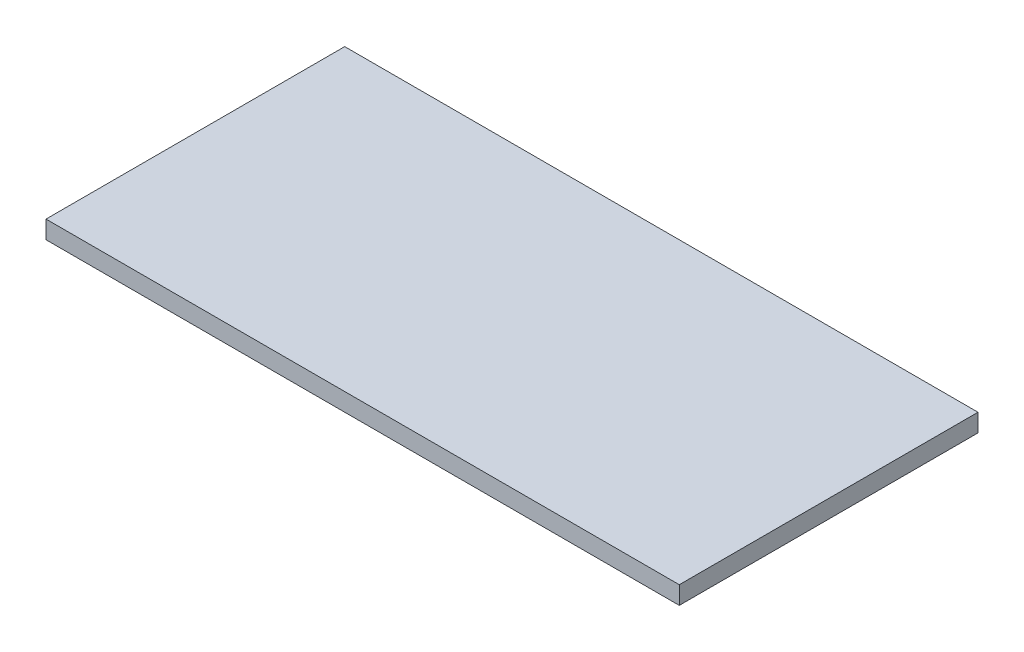
ISO-10303-21;
HEADER;
FILE_DESCRIPTION(('STEP AP214'),'2;1');
FILE_NAME('part.step','',(''),(''),'','','');
FILE_SCHEMA(('AUTOMOTIVE_DESIGN { 1 0 10303 214 1 1 1 1 }'));
ENDSEC;
DATA;
#1=APPLICATION_CONTEXT('core data for automotive mechanical design processes');
#2=APPLICATION_PROTOCOL_DEFINITION('international standard','automotive_design',2000,#1);
#3=PRODUCT_CONTEXT('',#1,'mechanical');
#4=PRODUCT('Part','Part','',(#3));
#5=PRODUCT_RELATED_PRODUCT_CATEGORY('part','',(#4));
#6=PRODUCT_DEFINITION_FORMATION('','',#4);
#7=PRODUCT_DEFINITION_CONTEXT('part definition',#1,'design');
#8=PRODUCT_DEFINITION('design','',#6,#7);
#9=PRODUCT_DEFINITION_SHAPE('','',#8);
#10=(LENGTH_UNIT() NAMED_UNIT(*) SI_UNIT(.MILLI.,.METRE.));
#11=(NAMED_UNIT(*) PLANE_ANGLE_UNIT() SI_UNIT($,.RADIAN.));
#12=(NAMED_UNIT(*) SI_UNIT($,.STERADIAN.) SOLID_ANGLE_UNIT());
#13=UNCERTAINTY_MEASURE_WITH_UNIT(LENGTH_MEASURE(1.E-05),#10,'distance_accuracy_value','');
#14=(GEOMETRIC_REPRESENTATION_CONTEXT(3) GLOBAL_UNCERTAINTY_ASSIGNED_CONTEXT((#13)) GLOBAL_UNIT_ASSIGNED_CONTEXT((#10,
#11,#12)) REPRESENTATION_CONTEXT('',''));
#15=CARTESIAN_POINT('',(0.,0.,0.));
#16=DIRECTION('',(0.,0.,1.));
#17=DIRECTION('',(1.,0.,0.));
#18=AXIS2_PLACEMENT_3D('',#15,#16,#17);
#19=CARTESIAN_POINT('',(0.,6.,0.));
#20=DIRECTION('',(1.,0.,0.));
#21=DIRECTION('',(0.,0.,-1.));
#22=AXIS2_PLACEMENT_3D('',#19,#20,#21);
#23=PLANE('',#22);
#24=DIRECTION('',(0.,0.,1.));
#25=VECTOR('',#24,1.);
#26=CARTESIAN_POINT('',(0.,0.,0.));
#27=LINE('',#26,#25);
#28=CARTESIAN_POINT('',(0.,0.,-100.));
#29=VERTEX_POINT('',#28);
#30=CARTESIAN_POINT('',(0.,0.,0.));
#31=VERTEX_POINT('',#30);
#32=EDGE_CURVE('E95',#29,#31,#27,.T.);
#33=ORIENTED_EDGE('',*,*,#32,.T.);
#34=DIRECTION('',(0.,-1.,0.));
#35=VECTOR('',#34,1.);
#36=CARTESIAN_POINT('',(0.,6.,0.));
#37=LINE('',#36,#35);
#38=CARTESIAN_POINT('',(0.,6.,0.));
#39=VERTEX_POINT('',#38);
#40=EDGE_CURVE('E11',#39,#31,#37,.T.);
#41=ORIENTED_EDGE('',*,*,#40,.F.);
#42=DIRECTION('',(0.,0.,1.));
#43=VECTOR('',#42,1.);
#44=CARTESIAN_POINT('',(0.,6.,0.));
#45=LINE('',#44,#43);
#46=CARTESIAN_POINT('',(0.,6.,-100.));
#47=VERTEX_POINT('',#46);
#48=EDGE_CURVE('E83',#47,#39,#45,.T.);
#49=ORIENTED_EDGE('',*,*,#48,.F.);
#50=DIRECTION('',(0.,-1.,0.));
#51=VECTOR('',#50,1.);
#52=CARTESIAN_POINT('',(0.,6.,-100.));
#53=LINE('',#52,#51);
#54=EDGE_CURVE('E91',#47,#29,#53,.T.);
#55=ORIENTED_EDGE('',*,*,#54,.T.);
#56=EDGE_LOOP('',(#33,#41,#49,#55));
#57=FACE_BOUND('',#56,.T.);
#58=ADVANCED_FACE('F32',(#57),#23,.F.);
#59=CARTESIAN_POINT('',(0.,6.,0.));
#60=DIRECTION('',(0.,0.,-1.));
#61=DIRECTION('',(-1.,0.,0.));
#62=AXIS2_PLACEMENT_3D('',#59,#60,#61);
#63=PLANE('',#62);
#64=DIRECTION('',(1.,0.,0.));
#65=VECTOR('',#64,1.);
#66=CARTESIAN_POINT('',(0.,0.,0.));
#67=LINE('',#66,#65);
#68=CARTESIAN_POINT('',(212.,0.,0.));
#69=VERTEX_POINT('',#68);
#70=EDGE_CURVE('E87',#31,#69,#67,.T.);
#71=ORIENTED_EDGE('',*,*,#70,.T.);
#72=DIRECTION('',(0.,-1.,0.));
#73=VECTOR('',#72,1.);
#74=CARTESIAN_POINT('',(212.,6.,0.));
#75=LINE('',#74,#73);
#76=CARTESIAN_POINT('',(212.,6.,0.));
#77=VERTEX_POINT('',#76);
#78=EDGE_CURVE('E40',#77,#69,#75,.T.);
#79=ORIENTED_EDGE('',*,*,#78,.F.);
#80=DIRECTION('',(1.,0.,0.));
#81=VECTOR('',#80,1.);
#82=CARTESIAN_POINT('',(0.,6.,0.));
#83=LINE('',#82,#81);
#84=EDGE_CURVE('E78',#39,#77,#83,.T.);
#85=ORIENTED_EDGE('',*,*,#84,.F.);
#86=ORIENTED_EDGE('',*,*,#40,.T.);
#87=EDGE_LOOP('',(#71,#79,#85,#86));
#88=FACE_BOUND('',#87,.T.);
#89=ADVANCED_FACE('F86',(#88),#63,.F.);
#90=CARTESIAN_POINT('',(212.,6.,0.));
#91=DIRECTION('',(-1.,0.,0.));
#92=DIRECTION('',(0.,0.,1.));
#93=AXIS2_PLACEMENT_3D('',#90,#91,#92);
#94=PLANE('',#93);
#95=DIRECTION('',(0.,0.,-1.));
#96=VECTOR('',#95,1.);
#97=CARTESIAN_POINT('',(212.,0.,0.));
#98=LINE('',#97,#96);
#99=CARTESIAN_POINT('',(212.,0.,-100.));
#100=VERTEX_POINT('',#99);
#101=EDGE_CURVE('E65',#69,#100,#98,.T.);
#102=ORIENTED_EDGE('',*,*,#101,.T.);
#103=DIRECTION('',(0.,-1.,0.));
#104=VECTOR('',#103,1.);
#105=CARTESIAN_POINT('',(212.,6.,-100.));
#106=LINE('',#105,#104);
#107=CARTESIAN_POINT('',(212.,6.,-100.));
#108=VERTEX_POINT('',#107);
#109=EDGE_CURVE('E88',#108,#100,#106,.T.);
#110=ORIENTED_EDGE('',*,*,#109,.F.);
#111=DIRECTION('',(0.,0.,-1.));
#112=VECTOR('',#111,1.);
#113=CARTESIAN_POINT('',(212.,6.,0.));
#114=LINE('',#113,#112);
#115=EDGE_CURVE('E81',#77,#108,#114,.T.);
#116=ORIENTED_EDGE('',*,*,#115,.F.);
#117=ORIENTED_EDGE('',*,*,#78,.T.);
#118=EDGE_LOOP('',(#102,#110,#116,#117));
#119=FACE_BOUND('',#118,.T.);
#120=ADVANCED_FACE('F89',(#119),#94,.F.);
#121=CARTESIAN_POINT('',(0.,6.,-100.));
#122=DIRECTION('',(0.,0.,1.));
#123=DIRECTION('',(1.,0.,0.));
#124=AXIS2_PLACEMENT_3D('',#121,#122,#123);
#125=PLANE('',#124);
#126=DIRECTION('',(-1.,0.,0.));
#127=VECTOR('',#126,1.);
#128=CARTESIAN_POINT('',(0.,0.,-100.));
#129=LINE('',#128,#127);
#130=EDGE_CURVE('E71',#100,#29,#129,.T.);
#131=ORIENTED_EDGE('',*,*,#130,.T.);
#132=ORIENTED_EDGE('',*,*,#54,.F.);
#133=DIRECTION('',(-1.,0.,0.));
#134=VECTOR('',#133,1.);
#135=CARTESIAN_POINT('',(0.,6.,-100.));
#136=LINE('',#135,#134);
#137=EDGE_CURVE('E48',#108,#47,#136,.T.);
#138=ORIENTED_EDGE('',*,*,#137,.F.);
#139=ORIENTED_EDGE('',*,*,#109,.T.);
#140=EDGE_LOOP('',(#131,#132,#138,#139));
#141=FACE_BOUND('',#140,.T.);
#142=ADVANCED_FACE('F102',(#141),#125,.F.);
#143=CARTESIAN_POINT('',(0.,6.,0.));
#144=DIRECTION('',(0.,-1.,0.));
#145=DIRECTION('',(0.,0.,-1.));
#146=AXIS2_PLACEMENT_3D('',#143,#144,#145);
#147=PLANE('',#146);
#148=ORIENTED_EDGE('',*,*,#48,.T.);
#149=ORIENTED_EDGE('',*,*,#84,.T.);
#150=ORIENTED_EDGE('',*,*,#115,.T.);
#151=ORIENTED_EDGE('',*,*,#137,.T.);
#152=EDGE_LOOP('',(#148,#149,#150,#151));
#153=FACE_BOUND('',#152,.T.);
#154=ADVANCED_FACE('F79',(#153),#147,.F.);
#155=CARTESIAN_POINT('',(0.,0.,0.));
#156=DIRECTION('',(0.,-1.,0.));
#157=DIRECTION('',(0.,0.,-1.));
#158=AXIS2_PLACEMENT_3D('',#155,#156,#157);
#159=PLANE('',#158);
#160=ORIENTED_EDGE('',*,*,#32,.F.);
#161=ORIENTED_EDGE('',*,*,#130,.F.);
#162=ORIENTED_EDGE('',*,*,#101,.F.);
#163=ORIENTED_EDGE('',*,*,#70,.F.);
#164=EDGE_LOOP('',(#160,#161,#162,#163));
#165=FACE_BOUND('',#164,.T.);
#166=ADVANCED_FACE('F105',(#165),#159,.T.);
#167=CLOSED_SHELL('',(#58,#89,#120,#142,#154,#166));
#168=MANIFOLD_SOLID_BREP('B2',#167);
#169=ADVANCED_BREP_SHAPE_REPRESENTATION('',(#18,#168),#14);
#170=SHAPE_DEFINITION_REPRESENTATION(#9,#169);
ENDSEC;
END-ISO-10303-21;
